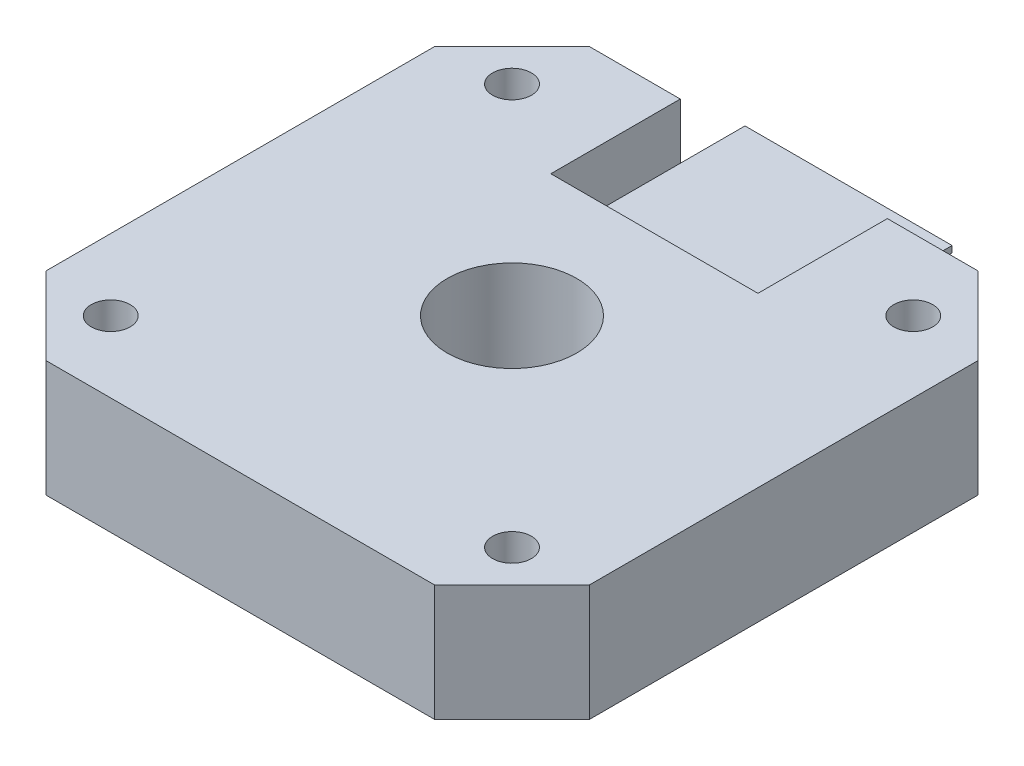
ISO-10303-21;
HEADER;
FILE_DESCRIPTION(('STEP AP214'),'2;1');
FILE_NAME('part.step','',(''),(''),'','','');
FILE_SCHEMA(('AUTOMOTIVE_DESIGN { 1 0 10303 214 1 1 1 1 }'));
ENDSEC;
DATA;
#1=APPLICATION_CONTEXT('core data for automotive mechanical design processes');
#2=APPLICATION_PROTOCOL_DEFINITION('international standard','automotive_design',2000,#1);
#3=PRODUCT_CONTEXT('',#1,'mechanical');
#4=PRODUCT('Part','Part','',(#3));
#5=PRODUCT_RELATED_PRODUCT_CATEGORY('part','',(#4));
#6=PRODUCT_DEFINITION_FORMATION('','',#4);
#7=PRODUCT_DEFINITION_CONTEXT('part definition',#1,'design');
#8=PRODUCT_DEFINITION('design','',#6,#7);
#9=PRODUCT_DEFINITION_SHAPE('','',#8);
#10=(LENGTH_UNIT() NAMED_UNIT(*) SI_UNIT(.MILLI.,.METRE.));
#11=(NAMED_UNIT(*) PLANE_ANGLE_UNIT() SI_UNIT($,.RADIAN.));
#12=(NAMED_UNIT(*) SI_UNIT($,.STERADIAN.) SOLID_ANGLE_UNIT());
#13=UNCERTAINTY_MEASURE_WITH_UNIT(LENGTH_MEASURE(1.E-05),#10,'distance_accuracy_value','');
#14=(GEOMETRIC_REPRESENTATION_CONTEXT(3) GLOBAL_UNCERTAINTY_ASSIGNED_CONTEXT((#13)) GLOBAL_UNIT_ASSIGNED_CONTEXT((#10,
#11,#12)) REPRESENTATION_CONTEXT('',''));
#15=CARTESIAN_POINT('',(0.,0.,0.));
#16=DIRECTION('',(0.,0.,1.));
#17=DIRECTION('',(1.,0.,0.));
#18=AXIS2_PLACEMENT_3D('',#15,#16,#17);
#19=CARTESIAN_POINT('',(8.00000000000001,4.7,-11.));
#20=DIRECTION('',(1.,0.,0.));
#21=DIRECTION('',(0.,0.,-1.));
#22=AXIS2_PLACEMENT_3D('',#19,#20,#21);
#23=PLANE('',#22);
#24=DIRECTION('',(0.,1.,0.));
#25=VECTOR('',#24,1.);
#26=CARTESIAN_POINT('',(8.00000000000001,4.45,-26.));
#27=LINE('',#26,#25);
#28=CARTESIAN_POINT('',(8.00000000000001,4.7,-26.));
#29=VERTEX_POINT('',#28);
#30=CARTESIAN_POINT('',(8.00000000000001,4.2,-26.));
#31=VERTEX_POINT('',#30);
#32=EDGE_CURVE('E449',#29,#31,#27,.F.);
#33=ORIENTED_EDGE('',*,*,#32,.F.);
#34=DIRECTION('',(0.,0.,1.));
#35=VECTOR('',#34,1.);
#36=CARTESIAN_POINT('',(8.00000000000001,4.7,-11.));
#37=LINE('',#36,#35);
#38=CARTESIAN_POINT('',(8.00000000000001,4.7,-21.));
#39=VERTEX_POINT('',#38);
#40=EDGE_CURVE('E411',#39,#29,#37,.F.);
#41=ORIENTED_EDGE('',*,*,#40,.F.);
#42=DIRECTION('',(0.,1.,0.));
#43=VECTOR('',#42,1.);
#44=CARTESIAN_POINT('',(8.00000000000001,4.7,-21.));
#45=LINE('',#44,#43);
#46=CARTESIAN_POINT('',(8.00000000000001,4.2,-21.));
#47=VERTEX_POINT('',#46);
#48=EDGE_CURVE('E459',#39,#47,#45,.F.);
#49=ORIENTED_EDGE('',*,*,#48,.T.);
#50=DIRECTION('',(0.,0.,1.));
#51=VECTOR('',#50,1.);
#52=CARTESIAN_POINT('',(8.00000000000001,4.2,-11.));
#53=LINE('',#52,#51);
#54=EDGE_CURVE('E414',#31,#47,#53,.T.);
#55=ORIENTED_EDGE('',*,*,#54,.F.);
#56=EDGE_LOOP('',(#33,#41,#49,#55));
#57=FACE_BOUND('',#56,.T.);
#58=ADVANCED_FACE('F17',(#57),#23,.T.);
#59=CARTESIAN_POINT('',(0.,4.45,-26.));
#60=DIRECTION('',(0.,0.,-1.));
#61=DIRECTION('',(-1.,0.,0.));
#62=AXIS2_PLACEMENT_3D('',#59,#60,#61);
#63=PLANE('',#62);
#64=DIRECTION('',(0.,1.,0.));
#65=VECTOR('',#64,1.);
#66=CARTESIAN_POINT('',(-7.99999999999999,4.2,-26.));
#67=LINE('',#66,#65);
#68=CARTESIAN_POINT('',(-7.99999999999999,4.7,-26.));
#69=VERTEX_POINT('',#68);
#70=CARTESIAN_POINT('',(-7.99999999999999,4.2,-26.));
#71=VERTEX_POINT('',#70);
#72=EDGE_CURVE('E444',#69,#71,#67,.F.);
#73=ORIENTED_EDGE('',*,*,#72,.F.);
#74=DIRECTION('',(1.,0.,0.));
#75=VECTOR('',#74,1.);
#76=CARTESIAN_POINT('',(-7.99999999999999,4.7,-26.));
#77=LINE('',#76,#75);
#78=EDGE_CURVE('E413',#29,#69,#77,.F.);
#79=ORIENTED_EDGE('',*,*,#78,.F.);
#80=ORIENTED_EDGE('',*,*,#32,.T.);
#81=DIRECTION('',(1.,0.,0.));
#82=VECTOR('',#81,1.);
#83=CARTESIAN_POINT('',(8.00000000000001,4.2,-26.));
#84=LINE('',#83,#82);
#85=EDGE_CURVE('E430',#71,#31,#84,.T.);
#86=ORIENTED_EDGE('',*,*,#85,.F.);
#87=EDGE_LOOP('',(#73,#79,#80,#86));
#88=FACE_BOUND('',#87,.T.);
#89=ADVANCED_FACE('F614',(#88),#63,.T.);
#90=CARTESIAN_POINT('',(-7.99999999999999,4.2,-11.));
#91=DIRECTION('',(-1.,0.,0.));
#92=DIRECTION('',(0.,0.,1.));
#93=AXIS2_PLACEMENT_3D('',#90,#91,#92);
#94=PLANE('',#93);
#95=ORIENTED_EDGE('',*,*,#72,.T.);
#96=DIRECTION('',(0.,0.,1.));
#97=VECTOR('',#96,1.);
#98=CARTESIAN_POINT('',(-7.99999999999999,4.2,-11.));
#99=LINE('',#98,#97);
#100=CARTESIAN_POINT('',(-7.99999999999999,4.2,-21.));
#101=VERTEX_POINT('',#100);
#102=EDGE_CURVE('E441',#101,#71,#99,.F.);
#103=ORIENTED_EDGE('',*,*,#102,.F.);
#104=DIRECTION('',(0.,1.,0.));
#105=VECTOR('',#104,1.);
#106=CARTESIAN_POINT('',(-7.99999999999999,4.2,-21.));
#107=LINE('',#106,#105);
#108=CARTESIAN_POINT('',(-7.99999999999999,4.7,-21.));
#109=VERTEX_POINT('',#108);
#110=EDGE_CURVE('E447',#101,#109,#107,.T.);
#111=ORIENTED_EDGE('',*,*,#110,.T.);
#112=DIRECTION('',(0.,0.,1.));
#113=VECTOR('',#112,1.);
#114=CARTESIAN_POINT('',(-7.99999999999999,4.7,-11.));
#115=LINE('',#114,#113);
#116=EDGE_CURVE('E408',#69,#109,#115,.T.);
#117=ORIENTED_EDGE('',*,*,#116,.F.);
#118=EDGE_LOOP('',(#95,#103,#111,#117));
#119=FACE_BOUND('',#118,.T.);
#120=ADVANCED_FACE('F1051',(#119),#94,.T.);
#121=CARTESIAN_POINT('',(8.00000000000001,4.2,-11.));
#122=DIRECTION('',(0.,-1.,0.));
#123=DIRECTION('',(1.,0.,0.));
#124=AXIS2_PLACEMENT_3D('',#121,#122,#123);
#125=PLANE('',#124);
#126=ORIENTED_EDGE('',*,*,#54,.T.);
#127=DIRECTION('',(0.,0.,1.));
#128=VECTOR('',#127,1.);
#129=CARTESIAN_POINT('',(8.00000000000001,4.2,-21.));
#130=LINE('',#129,#128);
#131=CARTESIAN_POINT('',(8.00000000000001,4.2,-11.));
#132=VERTEX_POINT('',#131);
#133=EDGE_CURVE('E388',#47,#132,#130,.T.);
#134=ORIENTED_EDGE('',*,*,#133,.T.);
#135=DIRECTION('',(1.,0.,0.));
#136=VECTOR('',#135,1.);
#137=CARTESIAN_POINT('',(0.,4.2,-11.));
#138=LINE('',#137,#136);
#139=CARTESIAN_POINT('',(-7.99999999999999,4.2,-11.));
#140=VERTEX_POINT('',#139);
#141=EDGE_CURVE('E394',#132,#140,#138,.F.);
#142=ORIENTED_EDGE('',*,*,#141,.T.);
#143=DIRECTION('',(0.,0.,1.));
#144=VECTOR('',#143,1.);
#145=CARTESIAN_POINT('',(-7.99999999999999,4.2,-21.));
#146=LINE('',#145,#144);
#147=EDGE_CURVE('E403',#140,#101,#146,.F.);
#148=ORIENTED_EDGE('',*,*,#147,.T.);
#149=ORIENTED_EDGE('',*,*,#102,.T.);
#150=ORIENTED_EDGE('',*,*,#85,.T.);
#151=EDGE_LOOP('',(#126,#134,#142,#148,#149,#150));
#152=FACE_BOUND('',#151,.T.);
#153=ADVANCED_FACE('F610',(#152),#125,.T.);
#154=CARTESIAN_POINT('',(-7.99999999999999,4.7,-11.));
#155=DIRECTION('',(0.,1.,0.));
#156=DIRECTION('',(0.,0.,1.));
#157=AXIS2_PLACEMENT_3D('',#154,#155,#156);
#158=PLANE('',#157);
#159=ORIENTED_EDGE('',*,*,#116,.T.);
#160=DIRECTION('',(0.,0.,1.));
#161=VECTOR('',#160,1.);
#162=CARTESIAN_POINT('',(-7.99999999999999,4.7,-21.));
#163=LINE('',#162,#161);
#164=CARTESIAN_POINT('',(-7.99999999999999,4.7,-11.));
#165=VERTEX_POINT('',#164);
#166=EDGE_CURVE('E363',#109,#165,#163,.T.);
#167=ORIENTED_EDGE('',*,*,#166,.T.);
#168=DIRECTION('',(1.,0.,0.));
#169=VECTOR('',#168,1.);
#170=CARTESIAN_POINT('',(0.,4.7,-11.));
#171=LINE('',#170,#169);
#172=CARTESIAN_POINT('',(8.00000000000001,4.7,-11.));
#173=VERTEX_POINT('',#172);
#174=EDGE_CURVE('E376',#165,#173,#171,.T.);
#175=ORIENTED_EDGE('',*,*,#174,.T.);
#176=DIRECTION('',(0.,0.,1.));
#177=VECTOR('',#176,1.);
#178=CARTESIAN_POINT('',(8.00000000000001,4.7,-21.));
#179=LINE('',#178,#177);
#180=EDGE_CURVE('E321',#173,#39,#179,.F.);
#181=ORIENTED_EDGE('',*,*,#180,.T.);
#182=ORIENTED_EDGE('',*,*,#40,.T.);
#183=ORIENTED_EDGE('',*,*,#78,.T.);
#184=EDGE_LOOP('',(#159,#167,#175,#181,#182,#183));
#185=FACE_BOUND('',#184,.T.);
#186=ADVANCED_FACE('F559',(#185),#158,.T.);
#187=CARTESIAN_POINT('',(-7.99999999999999,9.,-21.));
#188=DIRECTION('',(-1.,0.,0.));
#189=DIRECTION('',(0.,0.,1.));
#190=AXIS2_PLACEMENT_3D('',#187,#188,#189);
#191=PLANE('',#190);
#192=DIRECTION('',(0.,1.,0.));
#193=VECTOR('',#192,1.);
#194=CARTESIAN_POINT('',(-7.99999999999999,6.5,-11.));
#195=LINE('',#194,#193);
#196=CARTESIAN_POINT('',(-7.99999999999999,4.,-11.));
#197=VERTEX_POINT('',#196);
#198=EDGE_CURVE('E400',#140,#197,#195,.F.);
#199=ORIENTED_EDGE('',*,*,#198,.T.);
#200=DIRECTION('',(0.,0.,1.));
#201=VECTOR('',#200,1.);
#202=CARTESIAN_POINT('',(-7.99999999999999,4.,-23.));
#203=LINE('',#202,#201);
#204=CARTESIAN_POINT('',(-7.99999999999999,4.,-21.));
#205=VERTEX_POINT('',#204);
#206=EDGE_CURVE('E369',#205,#197,#203,.T.);
#207=ORIENTED_EDGE('',*,*,#206,.F.);
#208=DIRECTION('',(0.,1.,0.));
#209=VECTOR('',#208,1.);
#210=CARTESIAN_POINT('',(-7.99999999999999,9.,-21.));
#211=LINE('',#210,#209);
#212=EDGE_CURVE('E406',#101,#205,#211,.F.);
#213=ORIENTED_EDGE('',*,*,#212,.F.);
#214=ORIENTED_EDGE('',*,*,#147,.F.);
#215=EDGE_LOOP('',(#199,#207,#213,#214));
#216=FACE_BOUND('',#215,.T.);
#217=ADVANCED_FACE('F605',(#216),#191,.F.);
#218=CARTESIAN_POINT('',(0.,6.5,-11.));
#219=DIRECTION('',(0.,0.,1.));
#220=DIRECTION('',(1.,0.,0.));
#221=AXIS2_PLACEMENT_3D('',#218,#219,#220);
#222=PLANE('',#221);
#223=DIRECTION('',(0.,1.,0.));
#224=VECTOR('',#223,1.);
#225=CARTESIAN_POINT('',(8.00000000000001,4.,-11.));
#226=LINE('',#225,#224);
#227=CARTESIAN_POINT('',(8.00000000000001,4.,-11.));
#228=VERTEX_POINT('',#227);
#229=EDGE_CURVE('E389',#132,#228,#226,.F.);
#230=ORIENTED_EDGE('',*,*,#229,.T.);
#231=DIRECTION('',(1.,0.,0.));
#232=VECTOR('',#231,1.);
#233=CARTESIAN_POINT('',(0.,4.,-11.));
#234=LINE('',#233,#232);
#235=EDGE_CURVE('E302',#197,#228,#234,.T.);
#236=ORIENTED_EDGE('',*,*,#235,.F.);
#237=ORIENTED_EDGE('',*,*,#198,.F.);
#238=ORIENTED_EDGE('',*,*,#141,.F.);
#239=EDGE_LOOP('',(#230,#236,#237,#238));
#240=FACE_BOUND('',#239,.T.);
#241=ADVANCED_FACE('F608',(#240),#222,.F.);
#242=CARTESIAN_POINT('',(8.00000000000001,4.,-21.));
#243=DIRECTION('',(1.,0.,0.));
#244=DIRECTION('',(0.,1.,0.));
#245=AXIS2_PLACEMENT_3D('',#242,#243,#244);
#246=PLANE('',#245);
#247=DIRECTION('',(0.,1.,0.));
#248=VECTOR('',#247,1.);
#249=CARTESIAN_POINT('',(8.00000000000001,4.,-21.));
#250=LINE('',#249,#248);
#251=CARTESIAN_POINT('',(8.00000000000001,4.,-21.));
#252=VERTEX_POINT('',#251);
#253=EDGE_CURVE('E386',#252,#47,#250,.T.);
#254=ORIENTED_EDGE('',*,*,#253,.F.);
#255=DIRECTION('',(0.,0.,1.));
#256=VECTOR('',#255,1.);
#257=CARTESIAN_POINT('',(8.00000000000001,4.,-23.));
#258=LINE('',#257,#256);
#259=EDGE_CURVE('E298',#228,#252,#258,.F.);
#260=ORIENTED_EDGE('',*,*,#259,.F.);
#261=ORIENTED_EDGE('',*,*,#229,.F.);
#262=ORIENTED_EDGE('',*,*,#133,.F.);
#263=EDGE_LOOP('',(#254,#260,#261,#262));
#264=FACE_BOUND('',#263,.T.);
#265=ADVANCED_FACE('F548',(#264),#246,.F.);
#266=CARTESIAN_POINT('',(0.,6.5,-11.));
#267=DIRECTION('',(0.,0.,1.));
#268=DIRECTION('',(1.,0.,0.));
#269=AXIS2_PLACEMENT_3D('',#266,#267,#268);
#270=PLANE('',#269);
#271=DIRECTION('',(0.,1.,0.));
#272=VECTOR('',#271,1.);
#273=CARTESIAN_POINT('',(-7.99999999999999,9.,-11.));
#274=LINE('',#273,#272);
#275=CARTESIAN_POINT('',(-7.99999999999999,9.,-11.));
#276=VERTEX_POINT('',#275);
#277=EDGE_CURVE('E366',#165,#276,#274,.T.);
#278=ORIENTED_EDGE('',*,*,#277,.T.);
#279=DIRECTION('',(1.,0.,0.));
#280=VECTOR('',#279,1.);
#281=CARTESIAN_POINT('',(0.,9.,-11.));
#282=LINE('',#281,#280);
#283=CARTESIAN_POINT('',(8.00000000000001,9.,-11.));
#284=VERTEX_POINT('',#283);
#285=EDGE_CURVE('E314',#284,#276,#282,.F.);
#286=ORIENTED_EDGE('',*,*,#285,.F.);
#287=DIRECTION('',(0.,1.,0.));
#288=VECTOR('',#287,1.);
#289=CARTESIAN_POINT('',(8.00000000000001,4.,-11.));
#290=LINE('',#289,#288);
#291=EDGE_CURVE('E324',#284,#173,#290,.F.);
#292=ORIENTED_EDGE('',*,*,#291,.T.);
#293=ORIENTED_EDGE('',*,*,#174,.F.);
#294=EDGE_LOOP('',(#278,#286,#292,#293));
#295=FACE_BOUND('',#294,.T.);
#296=ADVANCED_FACE('F624',(#295),#270,.F.);
#297=CARTESIAN_POINT('',(-15.5,9.,15.5));
#298=DIRECTION('',(0.,-1.,0.));
#299=DIRECTION('',(0.,0.,-1.));
#300=AXIS2_PLACEMENT_3D('',#297,#298,#299);
#301=CYLINDRICAL_SURFACE('',#300,1.5);
#302=CARTESIAN_POINT('',(-15.5,9.,15.5));
#303=DIRECTION('',(0.,-1.,0.));
#304=DIRECTION('',(0.,0.,-1.));
#305=AXIS2_PLACEMENT_3D('',#302,#303,#304);
#306=CIRCLE('',#305,1.5);
#307=CARTESIAN_POINT('',(-15.5,9.,14.));
#308=VERTEX_POINT('',#307);
#309=EDGE_CURVE('E352',#308,#308,#306,.T.);
#310=ORIENTED_EDGE('',*,*,#309,.F.);
#311=EDGE_LOOP('',(#310));
#312=FACE_BOUND('',#311,.T.);
#313=CARTESIAN_POINT('',(-15.5,3.,15.5));
#314=DIRECTION('',(0.,-1.,0.));
#315=DIRECTION('',(0.,0.,-1.));
#316=AXIS2_PLACEMENT_3D('',#313,#314,#315);
#317=CIRCLE('',#316,1.5);
#318=CARTESIAN_POINT('',(-15.5,3.,14.));
#319=VERTEX_POINT('',#318);
#320=EDGE_CURVE('E507',#319,#319,#317,.F.);
#321=ORIENTED_EDGE('',*,*,#320,.F.);
#322=EDGE_LOOP('',(#321));
#323=FACE_BOUND('',#322,.T.);
#324=ADVANCED_FACE('F626',(#312,#323),#301,.F.);
#325=CARTESIAN_POINT('',(15.5,9.,15.5));
#326=DIRECTION('',(0.,1.,0.));
#327=DIRECTION('',(0.,0.,1.));
#328=AXIS2_PLACEMENT_3D('',#325,#326,#327);
#329=CYLINDRICAL_SURFACE('',#328,1.5);
#330=CARTESIAN_POINT('',(15.5,9.,15.5));
#331=DIRECTION('',(0.,1.,0.));
#332=DIRECTION('',(0.,0.,1.));
#333=AXIS2_PLACEMENT_3D('',#330,#331,#332);
#334=CIRCLE('',#333,1.5);
#335=CARTESIAN_POINT('',(15.5,9.,17.));
#336=VERTEX_POINT('',#335);
#337=EDGE_CURVE('E500',#336,#336,#334,.F.);
#338=ORIENTED_EDGE('',*,*,#337,.F.);
#339=EDGE_LOOP('',(#338));
#340=FACE_BOUND('',#339,.T.);
#341=CARTESIAN_POINT('',(15.5,3.,15.5));
#342=DIRECTION('',(0.,1.,0.));
#343=DIRECTION('',(0.,0.,1.));
#344=AXIS2_PLACEMENT_3D('',#341,#342,#343);
#345=CIRCLE('',#344,1.5);
#346=CARTESIAN_POINT('',(15.5,3.,17.));
#347=VERTEX_POINT('',#346);
#348=EDGE_CURVE('E315',#347,#347,#345,.F.);
#349=ORIENTED_EDGE('',*,*,#348,.T.);
#350=EDGE_LOOP('',(#349));
#351=FACE_BOUND('',#350,.T.);
#352=ADVANCED_FACE('F633',(#340,#351),#329,.F.);
#353=CARTESIAN_POINT('',(-15.5,9.,-15.5));
#354=DIRECTION('',(0.,1.,0.));
#355=DIRECTION('',(0.,0.,1.));
#356=AXIS2_PLACEMENT_3D('',#353,#354,#355);
#357=CYLINDRICAL_SURFACE('',#356,1.5);
#358=CARTESIAN_POINT('',(-15.5,9.,-15.5));
#359=DIRECTION('',(0.,1.,0.));
#360=DIRECTION('',(0.,0.,1.));
#361=AXIS2_PLACEMENT_3D('',#358,#359,#360);
#362=CIRCLE('',#361,1.5);
#363=CARTESIAN_POINT('',(-15.5,9.,-14.));
#364=VERTEX_POINT('',#363);
#365=EDGE_CURVE('E497',#364,#364,#362,.F.);
#366=ORIENTED_EDGE('',*,*,#365,.F.);
#367=EDGE_LOOP('',(#366));
#368=FACE_BOUND('',#367,.T.);
#369=CARTESIAN_POINT('',(-15.5,3.,-15.5));
#370=DIRECTION('',(0.,1.,0.));
#371=DIRECTION('',(0.,0.,1.));
#372=AXIS2_PLACEMENT_3D('',#369,#370,#371);
#373=CIRCLE('',#372,1.5);
#374=CARTESIAN_POINT('',(-15.5,3.,-14.));
#375=VERTEX_POINT('',#374);
#376=EDGE_CURVE('E513',#375,#375,#373,.F.);
#377=ORIENTED_EDGE('',*,*,#376,.T.);
#378=EDGE_LOOP('',(#377));
#379=FACE_BOUND('',#378,.T.);
#380=ADVANCED_FACE('F724',(#368,#379),#357,.F.);
#381=CARTESIAN_POINT('',(15.5,9.,-15.5));
#382=DIRECTION('',(0.,-1.,0.));
#383=DIRECTION('',(0.,0.,-1.));
#384=AXIS2_PLACEMENT_3D('',#381,#382,#383);
#385=CYLINDRICAL_SURFACE('',#384,1.5);
#386=CARTESIAN_POINT('',(15.5,9.,-15.5));
#387=DIRECTION('',(0.,-1.,0.));
#388=DIRECTION('',(0.,0.,-1.));
#389=AXIS2_PLACEMENT_3D('',#386,#387,#388);
#390=CIRCLE('',#389,1.5);
#391=CARTESIAN_POINT('',(15.5,9.,-17.));
#392=VERTEX_POINT('',#391);
#393=EDGE_CURVE('E291',#392,#392,#390,.T.);
#394=ORIENTED_EDGE('',*,*,#393,.F.);
#395=EDGE_LOOP('',(#394));
#396=FACE_BOUND('',#395,.T.);
#397=CARTESIAN_POINT('',(15.5,3.,-15.5));
#398=DIRECTION('',(0.,-1.,0.));
#399=DIRECTION('',(0.,0.,-1.));
#400=AXIS2_PLACEMENT_3D('',#397,#398,#399);
#401=CIRCLE('',#400,1.5);
#402=CARTESIAN_POINT('',(15.5,3.,-17.));
#403=VERTEX_POINT('',#402);
#404=EDGE_CURVE('E510',#403,#403,#401,.F.);
#405=ORIENTED_EDGE('',*,*,#404,.F.);
#406=EDGE_LOOP('',(#405));
#407=FACE_BOUND('',#406,.T.);
#408=ADVANCED_FACE('F721',(#396,#407),#385,.F.);
#409=CARTESIAN_POINT('',(-7.99999999999999,9.,-21.));
#410=DIRECTION('',(-1.,0.,0.));
#411=DIRECTION('',(0.,0.,1.));
#412=AXIS2_PLACEMENT_3D('',#409,#410,#411);
#413=PLANE('',#412);
#414=DIRECTION('',(0.,1.,0.));
#415=VECTOR('',#414,1.);
#416=CARTESIAN_POINT('',(-7.99999999999999,0.,-21.));
#417=LINE('',#416,#415);
#418=CARTESIAN_POINT('',(-7.99999999999999,9.,-21.));
#419=VERTEX_POINT('',#418);
#420=EDGE_CURVE('E284',#419,#109,#417,.F.);
#421=ORIENTED_EDGE('',*,*,#420,.F.);
#422=DIRECTION('',(0.,0.,1.));
#423=VECTOR('',#422,1.);
#424=CARTESIAN_POINT('',(-7.99999999999999,9.,0.));
#425=LINE('',#424,#423);
#426=EDGE_CURVE('E350',#276,#419,#425,.F.);
#427=ORIENTED_EDGE('',*,*,#426,.F.);
#428=ORIENTED_EDGE('',*,*,#277,.F.);
#429=ORIENTED_EDGE('',*,*,#166,.F.);
#430=EDGE_LOOP('',(#421,#427,#428,#429));
#431=FACE_BOUND('',#430,.T.);
#432=ADVANCED_FACE('F621',(#431),#413,.F.);
#433=CARTESIAN_POINT('',(8.00000000000001,4.,-21.));
#434=DIRECTION('',(1.,0.,0.));
#435=DIRECTION('',(0.,1.,0.));
#436=AXIS2_PLACEMENT_3D('',#433,#434,#435);
#437=PLANE('',#436);
#438=ORIENTED_EDGE('',*,*,#291,.F.);
#439=DIRECTION('',(0.,0.,1.));
#440=VECTOR('',#439,1.);
#441=CARTESIAN_POINT('',(8.00000000000001,9.,0.));
#442=LINE('',#441,#440);
#443=CARTESIAN_POINT('',(8.00000000000001,9.,-21.));
#444=VERTEX_POINT('',#443);
#445=EDGE_CURVE('E311',#444,#284,#442,.T.);
#446=ORIENTED_EDGE('',*,*,#445,.F.);
#447=DIRECTION('',(0.,1.,0.));
#448=VECTOR('',#447,1.);
#449=CARTESIAN_POINT('',(8.00000000000001,0.,-21.));
#450=LINE('',#449,#448);
#451=EDGE_CURVE('E212',#39,#444,#450,.T.);
#452=ORIENTED_EDGE('',*,*,#451,.F.);
#453=ORIENTED_EDGE('',*,*,#180,.F.);
#454=EDGE_LOOP('',(#438,#446,#452,#453));
#455=FACE_BOUND('',#454,.T.);
#456=ADVANCED_FACE('F561',(#455),#437,.F.);
#457=CARTESIAN_POINT('',(-7.49999999999999,0.,-24.5));
#458=DIRECTION('',(0.,1.,0.));
#459=DIRECTION('',(0.,0.,1.));
#460=AXIS2_PLACEMENT_3D('',#457,#458,#459);
#461=CYLINDRICAL_SURFACE('',#460,0.5);
#462=CARTESIAN_POINT('',(-7.49999999999999,0.,-24.5));
#463=DIRECTION('',(0.,1.,0.));
#464=DIRECTION('',(0.,0.,1.));
#465=AXIS2_PLACEMENT_3D('',#462,#463,#464);
#466=CIRCLE('',#465,0.5);
#467=CARTESIAN_POINT('',(-7.49999999999999,0.,-25.));
#468=VERTEX_POINT('',#467);
#469=CARTESIAN_POINT('',(-7.99999999999999,0.,-24.5));
#470=VERTEX_POINT('',#469);
#471=EDGE_CURVE('E20',#468,#470,#466,.T.);
#472=ORIENTED_EDGE('',*,*,#471,.T.);
#473=DIRECTION('',(0.,1.,0.));
#474=VECTOR('',#473,1.);
#475=CARTESIAN_POINT('',(-7.99999999999999,0.,-24.5));
#476=LINE('',#475,#474);
#477=CARTESIAN_POINT('',(-7.99999999999999,4.,-24.5));
#478=VERTEX_POINT('',#477);
#479=EDGE_CURVE('E287',#478,#470,#476,.F.);
#480=ORIENTED_EDGE('',*,*,#479,.F.);
#481=CARTESIAN_POINT('',(-7.49999999999999,4.,-24.5));
#482=DIRECTION('',(0.,1.,0.));
#483=DIRECTION('',(0.,0.,1.));
#484=AXIS2_PLACEMENT_3D('',#481,#482,#483);
#485=CIRCLE('',#484,0.5);
#486=CARTESIAN_POINT('',(-7.49999999999999,4.,-25.));
#487=VERTEX_POINT('',#486);
#488=EDGE_CURVE('E371',#487,#478,#485,.T.);
#489=ORIENTED_EDGE('',*,*,#488,.F.);
#490=DIRECTION('',(0.,1.,0.));
#491=VECTOR('',#490,1.);
#492=CARTESIAN_POINT('',(-7.49999999999999,0.,-25.));
#493=LINE('',#492,#491);
#494=EDGE_CURVE('E180',#468,#487,#493,.T.);
#495=ORIENTED_EDGE('',*,*,#494,.F.);
#496=EDGE_LOOP('',(#472,#480,#489,#495));
#497=FACE_BOUND('',#496,.T.);
#498=ADVANCED_FACE('F523',(#497),#461,.T.);
#499=CARTESIAN_POINT('',(0.,4.,-23.));
#500=DIRECTION('',(0.,1.,0.));
#501=DIRECTION('',(0.,0.,1.));
#502=AXIS2_PLACEMENT_3D('',#499,#500,#501);
#503=PLANE('',#502);
#504=CARTESIAN_POINT('',(7.50000000000001,4.,-24.5));
#505=DIRECTION('',(0.,1.,0.));
#506=DIRECTION('',(0.,0.,1.));
#507=AXIS2_PLACEMENT_3D('',#504,#505,#506);
#508=CIRCLE('',#507,0.5);
#509=CARTESIAN_POINT('',(7.50000000000001,4.,-25.));
#510=VERTEX_POINT('',#509);
#511=CARTESIAN_POINT('',(8.00000000000001,4.,-24.5));
#512=VERTEX_POINT('',#511);
#513=EDGE_CURVE('E301',#510,#512,#508,.F.);
#514=ORIENTED_EDGE('',*,*,#513,.F.);
#515=DIRECTION('',(-1.,0.,0.));
#516=VECTOR('',#515,1.);
#517=CARTESIAN_POINT('',(8.00000000000001,4.,-25.));
#518=LINE('',#517,#516);
#519=EDGE_CURVE('E292',#487,#510,#518,.F.);
#520=ORIENTED_EDGE('',*,*,#519,.F.);
#521=ORIENTED_EDGE('',*,*,#488,.T.);
#522=DIRECTION('',(0.,0.,1.));
#523=VECTOR('',#522,1.);
#524=CARTESIAN_POINT('',(-7.99999999999999,4.,-25.));
#525=LINE('',#524,#523);
#526=EDGE_CURVE('E290',#205,#478,#525,.F.);
#527=ORIENTED_EDGE('',*,*,#526,.F.);
#528=ORIENTED_EDGE('',*,*,#206,.T.);
#529=ORIENTED_EDGE('',*,*,#235,.T.);
#530=ORIENTED_EDGE('',*,*,#259,.T.);
#531=DIRECTION('',(0.,0.,-1.));
#532=VECTOR('',#531,1.);
#533=CARTESIAN_POINT('',(8.00000000000001,4.,-21.));
#534=LINE('',#533,#532);
#535=EDGE_CURVE('E176',#512,#252,#534,.F.);
#536=ORIENTED_EDGE('',*,*,#535,.F.);
#537=EDGE_LOOP('',(#514,#520,#521,#527,#528,#529,#530,#536));
#538=FACE_BOUND('',#537,.T.);
#539=ADVANCED_FACE('F542',(#538),#503,.T.);
#540=CARTESIAN_POINT('',(7.50000000000001,0.,-24.5));
#541=DIRECTION('',(0.,1.,0.));
#542=DIRECTION('',(0.,0.,1.));
#543=AXIS2_PLACEMENT_3D('',#540,#541,#542);
#544=CYLINDRICAL_SURFACE('',#543,0.5);
#545=CARTESIAN_POINT('',(7.50000000000001,0.,-24.5));
#546=DIRECTION('',(0.,1.,0.));
#547=DIRECTION('',(0.,0.,1.));
#548=AXIS2_PLACEMENT_3D('',#545,#546,#547);
#549=CIRCLE('',#548,0.5);
#550=CARTESIAN_POINT('',(8.00000000000001,0.,-24.5));
#551=VERTEX_POINT('',#550);
#552=CARTESIAN_POINT('',(7.50000000000001,0.,-25.));
#553=VERTEX_POINT('',#552);
#554=EDGE_CURVE('E187',#551,#553,#549,.T.);
#555=ORIENTED_EDGE('',*,*,#554,.T.);
#556=DIRECTION('',(0.,1.,0.));
#557=VECTOR('',#556,1.);
#558=CARTESIAN_POINT('',(7.50000000000001,0.,-25.));
#559=LINE('',#558,#557);
#560=EDGE_CURVE('E294',#510,#553,#559,.F.);
#561=ORIENTED_EDGE('',*,*,#560,.F.);
#562=ORIENTED_EDGE('',*,*,#513,.T.);
#563=DIRECTION('',(0.,1.,0.));
#564=VECTOR('',#563,1.);
#565=CARTESIAN_POINT('',(8.00000000000001,0.,-24.5));
#566=LINE('',#565,#564);
#567=EDGE_CURVE('E204',#551,#512,#566,.T.);
#568=ORIENTED_EDGE('',*,*,#567,.F.);
#569=EDGE_LOOP('',(#555,#561,#562,#568));
#570=FACE_BOUND('',#569,.T.);
#571=ADVANCED_FACE('F709',(#570),#544,.T.);
#572=CARTESIAN_POINT('',(-15.5,3.,-15.5));
#573=DIRECTION('',(0.,1.,0.));
#574=DIRECTION('',(0.,0.,1.));
#575=AXIS2_PLACEMENT_3D('',#572,#573,#574);
#576=PLANE('',#575);
#577=ORIENTED_EDGE('',*,*,#376,.F.);
#578=EDGE_LOOP('',(#577));
#579=FACE_BOUND('',#578,.T.);
#580=CARTESIAN_POINT('',(-15.5,3.,-15.5));
#581=DIRECTION('',(0.,1.,0.));
#582=DIRECTION('',(0.,0.,1.));
#583=AXIS2_PLACEMENT_3D('',#580,#581,#582);
#584=CIRCLE('',#583,3.);
#585=CARTESIAN_POINT('',(-15.5,3.,-12.5));
#586=VERTEX_POINT('',#585);
#587=EDGE_CURVE('E492',#586,#586,#584,.F.);
#588=ORIENTED_EDGE('',*,*,#587,.T.);
#589=EDGE_LOOP('',(#588));
#590=FACE_BOUND('',#589,.T.);
#591=ADVANCED_FACE('F705',(#579,#590),#576,.F.);
#592=CARTESIAN_POINT('',(15.5,3.,-15.5));
#593=DIRECTION('',(0.,-1.,0.));
#594=DIRECTION('',(0.,0.,-1.));
#595=AXIS2_PLACEMENT_3D('',#592,#593,#594);
#596=PLANE('',#595);
#597=ORIENTED_EDGE('',*,*,#404,.T.);
#598=EDGE_LOOP('',(#597));
#599=FACE_BOUND('',#598,.T.);
#600=CARTESIAN_POINT('',(15.5,3.,-15.5));
#601=DIRECTION('',(0.,-1.,0.));
#602=DIRECTION('',(0.,0.,-1.));
#603=AXIS2_PLACEMENT_3D('',#600,#601,#602);
#604=CIRCLE('',#603,3.);
#605=CARTESIAN_POINT('',(15.5,3.,-18.5));
#606=VERTEX_POINT('',#605);
#607=EDGE_CURVE('E489',#606,#606,#604,.T.);
#608=ORIENTED_EDGE('',*,*,#607,.T.);
#609=EDGE_LOOP('',(#608));
#610=FACE_BOUND('',#609,.T.);
#611=ADVANCED_FACE('F701',(#599,#610),#596,.T.);
#612=CARTESIAN_POINT('',(-15.5,3.,15.5));
#613=DIRECTION('',(0.,-1.,0.));
#614=DIRECTION('',(0.,0.,-1.));
#615=AXIS2_PLACEMENT_3D('',#612,#613,#614);
#616=PLANE('',#615);
#617=ORIENTED_EDGE('',*,*,#320,.T.);
#618=EDGE_LOOP('',(#617));
#619=FACE_BOUND('',#618,.T.);
#620=CARTESIAN_POINT('',(-15.5,3.,15.5));
#621=DIRECTION('',(0.,-1.,0.));
#622=DIRECTION('',(0.,0.,-1.));
#623=AXIS2_PLACEMENT_3D('',#620,#621,#622);
#624=CIRCLE('',#623,3.);
#625=CARTESIAN_POINT('',(-15.5,3.,12.5));
#626=VERTEX_POINT('',#625);
#627=EDGE_CURVE('E486',#626,#626,#624,.T.);
#628=ORIENTED_EDGE('',*,*,#627,.T.);
#629=EDGE_LOOP('',(#628));
#630=FACE_BOUND('',#629,.T.);
#631=ADVANCED_FACE('F697',(#619,#630),#616,.T.);
#632=CARTESIAN_POINT('',(15.5,3.,15.5));
#633=DIRECTION('',(0.,1.,0.));
#634=DIRECTION('',(0.,0.,1.));
#635=AXIS2_PLACEMENT_3D('',#632,#633,#634);
#636=PLANE('',#635);
#637=ORIENTED_EDGE('',*,*,#348,.F.);
#638=EDGE_LOOP('',(#637));
#639=FACE_BOUND('',#638,.T.);
#640=CARTESIAN_POINT('',(15.5,3.,15.5));
#641=DIRECTION('',(0.,1.,0.));
#642=DIRECTION('',(0.,0.,1.));
#643=AXIS2_PLACEMENT_3D('',#640,#641,#642);
#644=CIRCLE('',#643,3.);
#645=CARTESIAN_POINT('',(15.5,3.,18.5));
#646=VERTEX_POINT('',#645);
#647=EDGE_CURVE('E483',#646,#646,#644,.F.);
#648=ORIENTED_EDGE('',*,*,#647,.T.);
#649=EDGE_LOOP('',(#648));
#650=FACE_BOUND('',#649,.T.);
#651=ADVANCED_FACE('F693',(#639,#650),#636,.F.);
#652=CARTESIAN_POINT('',(0.,9.,0.));
#653=DIRECTION('',(0.,1.,0.));
#654=DIRECTION('',(0.,0.,1.));
#655=AXIS2_PLACEMENT_3D('',#652,#653,#654);
#656=PLANE('',#655);
#657=ORIENTED_EDGE('',*,*,#393,.T.);
#658=EDGE_LOOP('',(#657));
#659=FACE_BOUND('',#658,.T.);
#660=ORIENTED_EDGE('',*,*,#365,.T.);
#661=EDGE_LOOP('',(#660));
#662=FACE_BOUND('',#661,.T.);
#663=ORIENTED_EDGE('',*,*,#337,.T.);
#664=EDGE_LOOP('',(#663));
#665=FACE_BOUND('',#664,.T.);
#666=ORIENTED_EDGE('',*,*,#309,.T.);
#667=EDGE_LOOP('',(#666));
#668=FACE_BOUND('',#667,.T.);
#669=CARTESIAN_POINT('',(0.,9.,0.));
#670=DIRECTION('',(0.,1.,0.));
#671=DIRECTION('',(0.,0.,1.));
#672=AXIS2_PLACEMENT_3D('',#669,#670,#671);
#673=CIRCLE('',#672,5.);
#674=CARTESIAN_POINT('',(0.,9.,5.));
#675=VERTEX_POINT('',#674);
#676=EDGE_CURVE('E480',#675,#675,#673,.F.);
#677=ORIENTED_EDGE('',*,*,#676,.T.);
#678=EDGE_LOOP('',(#677));
#679=FACE_BOUND('',#678,.T.);
#680=DIRECTION('',(-0.707106781186548,0.,-0.707106781186548));
#681=VECTOR('',#680,1.);
#682=CARTESIAN_POINT('',(18.,9.00000000000001,-18.));
#683=LINE('',#682,#681);
#684=CARTESIAN_POINT('',(15.,9.,-21.));
#685=VERTEX_POINT('',#684);
#686=CARTESIAN_POINT('',(21.,9.00000000000001,-15.));
#687=VERTEX_POINT('',#686);
#688=EDGE_CURVE('E213',#685,#687,#683,.F.);
#689=ORIENTED_EDGE('',*,*,#688,.F.);
#690=DIRECTION('',(-1.,0.,0.));
#691=VECTOR('',#690,1.);
#692=CARTESIAN_POINT('',(21.,9.,-21.));
#693=LINE('',#692,#691);
#694=EDGE_CURVE('E205',#444,#685,#693,.F.);
#695=ORIENTED_EDGE('',*,*,#694,.F.);
#696=ORIENTED_EDGE('',*,*,#445,.T.);
#697=ORIENTED_EDGE('',*,*,#285,.T.);
#698=ORIENTED_EDGE('',*,*,#426,.T.);
#699=DIRECTION('',(-1.,0.,0.));
#700=VECTOR('',#699,1.);
#701=CARTESIAN_POINT('',(21.,9.,-21.));
#702=LINE('',#701,#700);
#703=CARTESIAN_POINT('',(-15.,9.00000000000001,-21.));
#704=VERTEX_POINT('',#703);
#705=EDGE_CURVE('E283',#704,#419,#702,.F.);
#706=ORIENTED_EDGE('',*,*,#705,.F.);
#707=DIRECTION('',(-0.707106781186548,0.,0.707106781186548));
#708=VECTOR('',#707,1.);
#709=CARTESIAN_POINT('',(-18.,9.00000000000001,-18.));
#710=LINE('',#709,#708);
#711=CARTESIAN_POINT('',(-21.,9.,-15.));
#712=VERTEX_POINT('',#711);
#713=EDGE_CURVE('E273',#712,#704,#710,.F.);
#714=ORIENTED_EDGE('',*,*,#713,.F.);
#715=DIRECTION('',(0.,0.,1.));
#716=VECTOR('',#715,1.);
#717=CARTESIAN_POINT('',(-21.,9.,-21.));
#718=LINE('',#717,#716);
#719=CARTESIAN_POINT('',(-21.,9.00000000000001,15.));
#720=VERTEX_POINT('',#719);
#721=EDGE_CURVE('E263',#720,#712,#718,.F.);
#722=ORIENTED_EDGE('',*,*,#721,.F.);
#723=DIRECTION('',(0.707106781186548,0.,0.707106781186548));
#724=VECTOR('',#723,1.);
#725=CARTESIAN_POINT('',(-18.,9.00000000000001,18.));
#726=LINE('',#725,#724);
#727=CARTESIAN_POINT('',(-15.,9.,21.));
#728=VERTEX_POINT('',#727);
#729=EDGE_CURVE('E253',#728,#720,#726,.F.);
#730=ORIENTED_EDGE('',*,*,#729,.F.);
#731=DIRECTION('',(1.,0.,0.));
#732=VECTOR('',#731,1.);
#733=CARTESIAN_POINT('',(-21.,9.,21.));
#734=LINE('',#733,#732);
#735=CARTESIAN_POINT('',(15.,9.00000000000001,21.));
#736=VERTEX_POINT('',#735);
#737=EDGE_CURVE('E243',#736,#728,#734,.F.);
#738=ORIENTED_EDGE('',*,*,#737,.F.);
#739=DIRECTION('',(0.707106781186548,0.,-0.707106781186548));
#740=VECTOR('',#739,1.);
#741=CARTESIAN_POINT('',(18.,9.00000000000001,18.));
#742=LINE('',#741,#740);
#743=CARTESIAN_POINT('',(21.,9.,15.));
#744=VERTEX_POINT('',#743);
#745=EDGE_CURVE('E233',#744,#736,#742,.F.);
#746=ORIENTED_EDGE('',*,*,#745,.F.);
#747=DIRECTION('',(0.,0.,-1.));
#748=VECTOR('',#747,1.);
#749=CARTESIAN_POINT('',(21.,9.,21.));
#750=LINE('',#749,#748);
#751=EDGE_CURVE('E223',#687,#744,#750,.F.);
#752=ORIENTED_EDGE('',*,*,#751,.F.);
#753=EDGE_LOOP('',(#689,#695,#696,#697,#698,#706,#714,#722,#730,#738,#746,#752));
#754=FACE_BOUND('',#753,.T.);
#755=ADVANCED_FACE('F566',(#659,#662,#665,#668,#679,#754),#656,.T.);
#756=CARTESIAN_POINT('',(-7.99999999999999,0.,-25.));
#757=DIRECTION('',(-1.,0.,0.));
#758=DIRECTION('',(0.,0.,1.));
#759=AXIS2_PLACEMENT_3D('',#756,#757,#758);
#760=PLANE('',#759);
#761=DIRECTION('',(0.,1.,0.));
#762=VECTOR('',#761,1.);
#763=CARTESIAN_POINT('',(-7.99999999999999,0.,-21.));
#764=LINE('',#763,#762);
#765=CARTESIAN_POINT('',(-7.99999999999999,0.,-21.));
#766=VERTEX_POINT('',#765);
#767=EDGE_CURVE('E281',#205,#766,#764,.F.);
#768=ORIENTED_EDGE('',*,*,#767,.F.);
#769=ORIENTED_EDGE('',*,*,#526,.T.);
#770=ORIENTED_EDGE('',*,*,#479,.T.);
#771=DIRECTION('',(0.,0.,1.));
#772=VECTOR('',#771,1.);
#773=CARTESIAN_POINT('',(-7.99999999999999,0.,0.));
#774=LINE('',#773,#772);
#775=EDGE_CURVE('E278',#470,#766,#774,.T.);
#776=ORIENTED_EDGE('',*,*,#775,.T.);
#777=EDGE_LOOP('',(#768,#769,#770,#776));
#778=FACE_BOUND('',#777,.T.);
#779=ADVANCED_FACE('F528',(#778),#760,.T.);
#780=CARTESIAN_POINT('',(21.,0.,-21.));
#781=DIRECTION('',(0.,0.,-1.));
#782=DIRECTION('',(-1.,0.,0.));
#783=AXIS2_PLACEMENT_3D('',#780,#781,#782);
#784=PLANE('',#783);
#785=DIRECTION('',(0.,1.,0.));
#786=VECTOR('',#785,1.);
#787=CARTESIAN_POINT('',(-15.,0.,-21.));
#788=LINE('',#787,#786);
#789=CARTESIAN_POINT('',(-15.,0.,-21.));
#790=VERTEX_POINT('',#789);
#791=EDGE_CURVE('E271',#704,#790,#788,.F.);
#792=ORIENTED_EDGE('',*,*,#791,.F.);
#793=ORIENTED_EDGE('',*,*,#705,.T.);
#794=ORIENTED_EDGE('',*,*,#420,.T.);
#795=ORIENTED_EDGE('',*,*,#110,.F.);
#796=ORIENTED_EDGE('',*,*,#212,.T.);
#797=ORIENTED_EDGE('',*,*,#767,.T.);
#798=DIRECTION('',(1.,0.,0.));
#799=VECTOR('',#798,1.);
#800=CARTESIAN_POINT('',(0.,0.,-21.));
#801=LINE('',#800,#799);
#802=EDGE_CURVE('E268',#766,#790,#801,.F.);
#803=ORIENTED_EDGE('',*,*,#802,.T.);
#804=EDGE_LOOP('',(#792,#793,#794,#795,#796,#797,#803));
#805=FACE_BOUND('',#804,.T.);
#806=ADVANCED_FACE('F600',(#805),#784,.T.);
#807=CARTESIAN_POINT('',(-18.,0.,-18.));
#808=DIRECTION('',(-0.707106781186548,0.,-0.707106781186548));
#809=DIRECTION('',(-0.707106781186548,0.,0.707106781186548));
#810=AXIS2_PLACEMENT_3D('',#807,#808,#809);
#811=PLANE('',#810);
#812=DIRECTION('',(-0.707106781186547,0.,0.707106781186547));
#813=VECTOR('',#812,1.);
#814=CARTESIAN_POINT('',(-15.,0.,-21.));
#815=LINE('',#814,#813);
#816=CARTESIAN_POINT('',(-21.,0.,-15.));
#817=VERTEX_POINT('',#816);
#818=EDGE_CURVE('E258',#790,#817,#815,.T.);
#819=ORIENTED_EDGE('',*,*,#818,.T.);
#820=DIRECTION('',(0.,1.,0.));
#821=VECTOR('',#820,1.);
#822=CARTESIAN_POINT('',(-21.,0.,-15.));
#823=LINE('',#822,#821);
#824=EDGE_CURVE('E261',#712,#817,#823,.F.);
#825=ORIENTED_EDGE('',*,*,#824,.F.);
#826=ORIENTED_EDGE('',*,*,#713,.T.);
#827=ORIENTED_EDGE('',*,*,#791,.T.);
#828=EDGE_LOOP('',(#819,#825,#826,#827));
#829=FACE_BOUND('',#828,.T.);
#830=ADVANCED_FACE('F596',(#829),#811,.T.);
#831=CARTESIAN_POINT('',(-21.,0.,-21.));
#832=DIRECTION('',(-1.,0.,0.));
#833=DIRECTION('',(0.,0.,1.));
#834=AXIS2_PLACEMENT_3D('',#831,#832,#833);
#835=PLANE('',#834);
#836=ORIENTED_EDGE('',*,*,#824,.T.);
#837=DIRECTION('',(0.,0.,1.));
#838=VECTOR('',#837,1.);
#839=CARTESIAN_POINT('',(-21.,0.,0.));
#840=LINE('',#839,#838);
#841=CARTESIAN_POINT('',(-21.,0.,15.));
#842=VERTEX_POINT('',#841);
#843=EDGE_CURVE('E248',#817,#842,#840,.T.);
#844=ORIENTED_EDGE('',*,*,#843,.T.);
#845=DIRECTION('',(0.,1.,0.));
#846=VECTOR('',#845,1.);
#847=CARTESIAN_POINT('',(-21.,0.,15.));
#848=LINE('',#847,#846);
#849=EDGE_CURVE('E251',#720,#842,#848,.F.);
#850=ORIENTED_EDGE('',*,*,#849,.F.);
#851=ORIENTED_EDGE('',*,*,#721,.T.);
#852=EDGE_LOOP('',(#836,#844,#850,#851));
#853=FACE_BOUND('',#852,.T.);
#854=ADVANCED_FACE('F592',(#853),#835,.T.);
#855=CARTESIAN_POINT('',(-18.,0.,18.));
#856=DIRECTION('',(-0.707106781186548,0.,0.707106781186548));
#857=DIRECTION('',(0.707106781186548,0.,0.707106781186548));
#858=AXIS2_PLACEMENT_3D('',#855,#856,#857);
#859=PLANE('',#858);
#860=DIRECTION('',(0.707106781186547,0.,0.707106781186547));
#861=VECTOR('',#860,1.);
#862=CARTESIAN_POINT('',(-21.,0.,15.));
#863=LINE('',#862,#861);
#864=CARTESIAN_POINT('',(-15.,0.,21.));
#865=VERTEX_POINT('',#864);
#866=EDGE_CURVE('E238',#842,#865,#863,.T.);
#867=ORIENTED_EDGE('',*,*,#866,.T.);
#868=DIRECTION('',(0.,1.,0.));
#869=VECTOR('',#868,1.);
#870=CARTESIAN_POINT('',(-15.,0.,21.));
#871=LINE('',#870,#869);
#872=EDGE_CURVE('E241',#728,#865,#871,.F.);
#873=ORIENTED_EDGE('',*,*,#872,.F.);
#874=ORIENTED_EDGE('',*,*,#729,.T.);
#875=ORIENTED_EDGE('',*,*,#849,.T.);
#876=EDGE_LOOP('',(#867,#873,#874,#875));
#877=FACE_BOUND('',#876,.T.);
#878=ADVANCED_FACE('F587',(#877),#859,.T.);
#879=CARTESIAN_POINT('',(-21.,0.,21.));
#880=DIRECTION('',(0.,0.,1.));
#881=DIRECTION('',(1.,0.,0.));
#882=AXIS2_PLACEMENT_3D('',#879,#880,#881);
#883=PLANE('',#882);
#884=ORIENTED_EDGE('',*,*,#872,.T.);
#885=DIRECTION('',(1.,0.,0.));
#886=VECTOR('',#885,1.);
#887=CARTESIAN_POINT('',(0.,0.,21.));
#888=LINE('',#887,#886);
#889=CARTESIAN_POINT('',(15.,0.,21.));
#890=VERTEX_POINT('',#889);
#891=EDGE_CURVE('E229',#865,#890,#888,.T.);
#892=ORIENTED_EDGE('',*,*,#891,.T.);
#893=DIRECTION('',(0.,1.,0.));
#894=VECTOR('',#893,1.);
#895=CARTESIAN_POINT('',(15.,0.,21.));
#896=LINE('',#895,#894);
#897=EDGE_CURVE('E224',#736,#890,#896,.F.);
#898=ORIENTED_EDGE('',*,*,#897,.F.);
#899=ORIENTED_EDGE('',*,*,#737,.T.);
#900=EDGE_LOOP('',(#884,#892,#898,#899));
#901=FACE_BOUND('',#900,.T.);
#902=ADVANCED_FACE('F583',(#901),#883,.T.);
#903=CARTESIAN_POINT('',(18.,0.,18.));
#904=DIRECTION('',(0.707106781186548,0.,0.707106781186548));
#905=DIRECTION('',(0.707106781186548,0.,-0.707106781186548));
#906=AXIS2_PLACEMENT_3D('',#903,#904,#905);
#907=PLANE('',#906);
#908=DIRECTION('',(0.707106781186547,0.,-0.707106781186547));
#909=VECTOR('',#908,1.);
#910=CARTESIAN_POINT('',(15.,0.,21.));
#911=LINE('',#910,#909);
#912=CARTESIAN_POINT('',(21.,0.,15.));
#913=VERTEX_POINT('',#912);
#914=EDGE_CURVE('E218',#890,#913,#911,.T.);
#915=ORIENTED_EDGE('',*,*,#914,.T.);
#916=DIRECTION('',(0.,1.,0.));
#917=VECTOR('',#916,1.);
#918=CARTESIAN_POINT('',(21.,0.,15.));
#919=LINE('',#918,#917);
#920=EDGE_CURVE('E221',#744,#913,#919,.F.);
#921=ORIENTED_EDGE('',*,*,#920,.F.);
#922=ORIENTED_EDGE('',*,*,#745,.T.);
#923=ORIENTED_EDGE('',*,*,#897,.T.);
#924=EDGE_LOOP('',(#915,#921,#922,#923));
#925=FACE_BOUND('',#924,.T.);
#926=ADVANCED_FACE('F577',(#925),#907,.T.);
#927=CARTESIAN_POINT('',(21.,0.,21.));
#928=DIRECTION('',(1.,0.,0.));
#929=DIRECTION('',(0.,0.,-1.));
#930=AXIS2_PLACEMENT_3D('',#927,#928,#929);
#931=PLANE('',#930);
#932=DIRECTION('',(0.,1.,0.));
#933=VECTOR('',#932,1.);
#934=CARTESIAN_POINT('',(21.,0.,-15.));
#935=LINE('',#934,#933);
#936=CARTESIAN_POINT('',(21.,0.,-15.));
#937=VERTEX_POINT('',#936);
#938=EDGE_CURVE('E210',#687,#937,#935,.F.);
#939=ORIENTED_EDGE('',*,*,#938,.F.);
#940=ORIENTED_EDGE('',*,*,#751,.T.);
#941=ORIENTED_EDGE('',*,*,#920,.T.);
#942=DIRECTION('',(0.,0.,1.));
#943=VECTOR('',#942,1.);
#944=CARTESIAN_POINT('',(21.,0.,0.));
#945=LINE('',#944,#943);
#946=EDGE_CURVE('E196',#913,#937,#945,.F.);
#947=ORIENTED_EDGE('',*,*,#946,.T.);
#948=EDGE_LOOP('',(#939,#940,#941,#947));
#949=FACE_BOUND('',#948,.T.);
#950=ADVANCED_FACE('F574',(#949),#931,.T.);
#951=CARTESIAN_POINT('',(18.,0.,-18.));
#952=DIRECTION('',(0.707106781186548,0.,-0.707106781186548));
#953=DIRECTION('',(-0.707106781186548,0.,-0.707106781186548));
#954=AXIS2_PLACEMENT_3D('',#951,#952,#953);
#955=PLANE('',#954);
#956=DIRECTION('',(-0.707106781186547,0.,-0.707106781186547));
#957=VECTOR('',#956,1.);
#958=CARTESIAN_POINT('',(21.,0.,-15.));
#959=LINE('',#958,#957);
#960=CARTESIAN_POINT('',(15.,0.,-21.));
#961=VERTEX_POINT('',#960);
#962=EDGE_CURVE('E194',#937,#961,#959,.T.);
#963=ORIENTED_EDGE('',*,*,#962,.T.);
#964=DIRECTION('',(0.,1.,0.));
#965=VECTOR('',#964,1.);
#966=CARTESIAN_POINT('',(15.,0.,-21.));
#967=LINE('',#966,#965);
#968=EDGE_CURVE('E193',#685,#961,#967,.F.);
#969=ORIENTED_EDGE('',*,*,#968,.F.);
#970=ORIENTED_EDGE('',*,*,#688,.T.);
#971=ORIENTED_EDGE('',*,*,#938,.T.);
#972=EDGE_LOOP('',(#963,#969,#970,#971));
#973=FACE_BOUND('',#972,.T.);
#974=ADVANCED_FACE('F570',(#973),#955,.T.);
#975=CARTESIAN_POINT('',(21.,0.,-21.));
#976=DIRECTION('',(0.,0.,-1.));
#977=DIRECTION('',(-1.,0.,0.));
#978=AXIS2_PLACEMENT_3D('',#975,#976,#977);
#979=PLANE('',#978);
#980=DIRECTION('',(1.,0.,0.));
#981=VECTOR('',#980,1.);
#982=CARTESIAN_POINT('',(0.,0.,-21.));
#983=LINE('',#982,#981);
#984=CARTESIAN_POINT('',(8.00000000000001,0.,-21.));
#985=VERTEX_POINT('',#984);
#986=EDGE_CURVE('E185',#961,#985,#983,.F.);
#987=ORIENTED_EDGE('',*,*,#986,.T.);
#988=DIRECTION('',(0.,1.,0.));
#989=VECTOR('',#988,1.);
#990=CARTESIAN_POINT('',(8.00000000000001,0.,-21.));
#991=LINE('',#990,#989);
#992=EDGE_CURVE('E170',#252,#985,#991,.F.);
#993=ORIENTED_EDGE('',*,*,#992,.F.);
#994=ORIENTED_EDGE('',*,*,#253,.T.);
#995=ORIENTED_EDGE('',*,*,#48,.F.);
#996=ORIENTED_EDGE('',*,*,#451,.T.);
#997=ORIENTED_EDGE('',*,*,#694,.T.);
#998=ORIENTED_EDGE('',*,*,#968,.T.);
#999=EDGE_LOOP('',(#987,#993,#994,#995,#996,#997,#998));
#1000=FACE_BOUND('',#999,.T.);
#1001=ADVANCED_FACE('F191',(#1000),#979,.T.);
#1002=CARTESIAN_POINT('',(8.00000000000001,0.,-21.));
#1003=DIRECTION('',(1.,0.,0.));
#1004=DIRECTION('',(0.,0.,-1.));
#1005=AXIS2_PLACEMENT_3D('',#1002,#1003,#1004);
#1006=PLANE('',#1005);
#1007=ORIENTED_EDGE('',*,*,#992,.T.);
#1008=DIRECTION('',(0.,0.,1.));
#1009=VECTOR('',#1008,1.);
#1010=CARTESIAN_POINT('',(8.00000000000001,0.,0.));
#1011=LINE('',#1010,#1009);
#1012=EDGE_CURVE('E174',#985,#551,#1011,.F.);
#1013=ORIENTED_EDGE('',*,*,#1012,.T.);
#1014=ORIENTED_EDGE('',*,*,#567,.T.);
#1015=ORIENTED_EDGE('',*,*,#535,.T.);
#1016=EDGE_LOOP('',(#1007,#1013,#1014,#1015));
#1017=FACE_BOUND('',#1016,.T.);
#1018=ADVANCED_FACE('F172',(#1017),#1006,.T.);
#1019=CARTESIAN_POINT('',(8.00000000000001,0.,-25.));
#1020=DIRECTION('',(0.,0.,-1.));
#1021=DIRECTION('',(-1.,0.,0.));
#1022=AXIS2_PLACEMENT_3D('',#1019,#1020,#1021);
#1023=PLANE('',#1022);
#1024=ORIENTED_EDGE('',*,*,#560,.T.);
#1025=DIRECTION('',(1.,0.,0.));
#1026=VECTOR('',#1025,1.);
#1027=CARTESIAN_POINT('',(0.,0.,-25.));
#1028=LINE('',#1027,#1026);
#1029=EDGE_CURVE('E189',#553,#468,#1028,.F.);
#1030=ORIENTED_EDGE('',*,*,#1029,.T.);
#1031=ORIENTED_EDGE('',*,*,#494,.T.);
#1032=ORIENTED_EDGE('',*,*,#519,.T.);
#1033=EDGE_LOOP('',(#1024,#1030,#1031,#1032));
#1034=FACE_BOUND('',#1033,.T.);
#1035=ADVANCED_FACE('F664',(#1034),#1023,.T.);
#1036=CARTESIAN_POINT('',(-15.5,0.,-15.5));
#1037=DIRECTION('',(0.,1.,0.));
#1038=DIRECTION('',(0.,0.,1.));
#1039=AXIS2_PLACEMENT_3D('',#1036,#1037,#1038);
#1040=CYLINDRICAL_SURFACE('',#1039,3.);
#1041=CARTESIAN_POINT('',(-15.5,0.,-15.5));
#1042=DIRECTION('',(0.,1.,0.));
#1043=DIRECTION('',(0.,0.,1.));
#1044=AXIS2_PLACEMENT_3D('',#1041,#1042,#1043);
#1045=CIRCLE('',#1044,3.);
#1046=CARTESIAN_POINT('',(-15.5,0.,-12.5));
#1047=VERTEX_POINT('',#1046);
#1048=EDGE_CURVE('E477',#1047,#1047,#1045,.F.);
#1049=ORIENTED_EDGE('',*,*,#1048,.T.);
#1050=EDGE_LOOP('',(#1049));
#1051=FACE_BOUND('',#1050,.T.);
#1052=ORIENTED_EDGE('',*,*,#587,.F.);
#1053=EDGE_LOOP('',(#1052));
#1054=FACE_BOUND('',#1053,.T.);
#1055=ADVANCED_FACE('F660',(#1051,#1054),#1040,.F.);
#1056=CARTESIAN_POINT('',(15.5,0.,-15.5));
#1057=DIRECTION('',(0.,-1.,0.));
#1058=DIRECTION('',(0.,0.,-1.));
#1059=AXIS2_PLACEMENT_3D('',#1056,#1057,#1058);
#1060=CYLINDRICAL_SURFACE('',#1059,3.);
#1061=CARTESIAN_POINT('',(15.5,0.,-15.5));
#1062=DIRECTION('',(0.,-1.,0.));
#1063=DIRECTION('',(0.,0.,-1.));
#1064=AXIS2_PLACEMENT_3D('',#1061,#1062,#1063);
#1065=CIRCLE('',#1064,3.);
#1066=CARTESIAN_POINT('',(15.5,0.,-18.5));
#1067=VERTEX_POINT('',#1066);
#1068=EDGE_CURVE('E474',#1067,#1067,#1065,.T.);
#1069=ORIENTED_EDGE('',*,*,#1068,.T.);
#1070=EDGE_LOOP('',(#1069));
#1071=FACE_BOUND('',#1070,.T.);
#1072=ORIENTED_EDGE('',*,*,#607,.F.);
#1073=EDGE_LOOP('',(#1072));
#1074=FACE_BOUND('',#1073,.T.);
#1075=ADVANCED_FACE('F656',(#1071,#1074),#1060,.F.);
#1076=CARTESIAN_POINT('',(-15.5,0.,15.5));
#1077=DIRECTION('',(0.,-1.,0.));
#1078=DIRECTION('',(0.,0.,-1.));
#1079=AXIS2_PLACEMENT_3D('',#1076,#1077,#1078);
#1080=CYLINDRICAL_SURFACE('',#1079,3.);
#1081=CARTESIAN_POINT('',(-15.5,0.,15.5));
#1082=DIRECTION('',(0.,-1.,0.));
#1083=DIRECTION('',(0.,0.,-1.));
#1084=AXIS2_PLACEMENT_3D('',#1081,#1082,#1083);
#1085=CIRCLE('',#1084,3.);
#1086=CARTESIAN_POINT('',(-15.5,0.,12.5));
#1087=VERTEX_POINT('',#1086);
#1088=EDGE_CURVE('E471',#1087,#1087,#1085,.T.);
#1089=ORIENTED_EDGE('',*,*,#1088,.T.);
#1090=EDGE_LOOP('',(#1089));
#1091=FACE_BOUND('',#1090,.T.);
#1092=ORIENTED_EDGE('',*,*,#627,.F.);
#1093=EDGE_LOOP('',(#1092));
#1094=FACE_BOUND('',#1093,.T.);
#1095=ADVANCED_FACE('F652',(#1091,#1094),#1080,.F.);
#1096=CARTESIAN_POINT('',(15.5,0.,15.5));
#1097=DIRECTION('',(0.,1.,0.));
#1098=DIRECTION('',(0.,0.,1.));
#1099=AXIS2_PLACEMENT_3D('',#1096,#1097,#1098);
#1100=CYLINDRICAL_SURFACE('',#1099,3.);
#1101=CARTESIAN_POINT('',(15.5,0.,15.5));
#1102=DIRECTION('',(0.,1.,0.));
#1103=DIRECTION('',(0.,0.,1.));
#1104=AXIS2_PLACEMENT_3D('',#1101,#1102,#1103);
#1105=CIRCLE('',#1104,3.);
#1106=CARTESIAN_POINT('',(15.5,0.,18.5));
#1107=VERTEX_POINT('',#1106);
#1108=EDGE_CURVE('E26',#1107,#1107,#1105,.F.);
#1109=ORIENTED_EDGE('',*,*,#1108,.T.);
#1110=EDGE_LOOP('',(#1109));
#1111=FACE_BOUND('',#1110,.T.);
#1112=ORIENTED_EDGE('',*,*,#647,.F.);
#1113=EDGE_LOOP('',(#1112));
#1114=FACE_BOUND('',#1113,.T.);
#1115=ADVANCED_FACE('F644',(#1111,#1114),#1100,.F.);
#1116=CARTESIAN_POINT('',(0.,0.,0.));
#1117=DIRECTION('',(0.,1.,0.));
#1118=DIRECTION('',(0.,0.,1.));
#1119=AXIS2_PLACEMENT_3D('',#1116,#1117,#1118);
#1120=CYLINDRICAL_SURFACE('',#1119,5.);
#1121=CARTESIAN_POINT('',(0.,0.,0.));
#1122=DIRECTION('',(0.,1.,0.));
#1123=DIRECTION('',(0.,0.,1.));
#1124=AXIS2_PLACEMENT_3D('',#1121,#1122,#1123);
#1125=CIRCLE('',#1124,5.);
#1126=CARTESIAN_POINT('',(0.,0.,5.));
#1127=VERTEX_POINT('',#1126);
#1128=EDGE_CURVE('E11',#1127,#1127,#1125,.F.);
#1129=ORIENTED_EDGE('',*,*,#1128,.T.);
#1130=EDGE_LOOP('',(#1129));
#1131=FACE_BOUND('',#1130,.T.);
#1132=ORIENTED_EDGE('',*,*,#676,.F.);
#1133=EDGE_LOOP('',(#1132));
#1134=FACE_BOUND('',#1133,.T.);
#1135=ADVANCED_FACE('F638',(#1131,#1134),#1120,.F.);
#1136=CARTESIAN_POINT('',(0.,0.,0.));
#1137=DIRECTION('',(0.,1.,0.));
#1138=DIRECTION('',(0.,0.,1.));
#1139=AXIS2_PLACEMENT_3D('',#1136,#1137,#1138);
#1140=PLANE('',#1139);
#1141=ORIENTED_EDGE('',*,*,#1128,.F.);
#1142=EDGE_LOOP('',(#1141));
#1143=FACE_BOUND('',#1142,.T.);
#1144=ORIENTED_EDGE('',*,*,#1108,.F.);
#1145=EDGE_LOOP('',(#1144));
#1146=FACE_BOUND('',#1145,.T.);
#1147=ORIENTED_EDGE('',*,*,#1088,.F.);
#1148=EDGE_LOOP('',(#1147));
#1149=FACE_BOUND('',#1148,.T.);
#1150=ORIENTED_EDGE('',*,*,#1068,.F.);
#1151=EDGE_LOOP('',(#1150));
#1152=FACE_BOUND('',#1151,.T.);
#1153=ORIENTED_EDGE('',*,*,#1048,.F.);
#1154=EDGE_LOOP('',(#1153));
#1155=FACE_BOUND('',#1154,.T.);
#1156=ORIENTED_EDGE('',*,*,#1029,.F.);
#1157=ORIENTED_EDGE('',*,*,#554,.F.);
#1158=ORIENTED_EDGE('',*,*,#1012,.F.);
#1159=ORIENTED_EDGE('',*,*,#986,.F.);
#1160=ORIENTED_EDGE('',*,*,#962,.F.);
#1161=ORIENTED_EDGE('',*,*,#946,.F.);
#1162=ORIENTED_EDGE('',*,*,#914,.F.);
#1163=ORIENTED_EDGE('',*,*,#891,.F.);
#1164=ORIENTED_EDGE('',*,*,#866,.F.);
#1165=ORIENTED_EDGE('',*,*,#843,.F.);
#1166=ORIENTED_EDGE('',*,*,#818,.F.);
#1167=ORIENTED_EDGE('',*,*,#802,.F.);
#1168=ORIENTED_EDGE('',*,*,#775,.F.);
#1169=ORIENTED_EDGE('',*,*,#471,.F.);
#1170=EDGE_LOOP('',(#1156,#1157,#1158,#1159,#1160,#1161,#1162,#1163,#1164,#1165,#1166,#1167,
#1168,#1169));
#1171=FACE_BOUND('',#1170,.T.);
#1172=ADVANCED_FACE('F183',(#1143,#1146,#1149,#1152,#1155,#1171),#1140,.F.);
#1173=CLOSED_SHELL('',(#58,#89,#120,#153,#186,#217,#241,#265,#296,#324,#352,#380,#408,#432,#456,
#498,#539,#571,#591,#611,#631,#651,#755,#779,#806,#830,#854,#878,#902,#926,#950,#974,#1001,
#1018,#1035,#1055,#1075,#1095,#1115,#1135,#1172));
#1174=MANIFOLD_SOLID_BREP('B1',#1173);
#1175=ADVANCED_BREP_SHAPE_REPRESENTATION('',(#18,#1174),#14);
#1176=SHAPE_DEFINITION_REPRESENTATION(#9,#1175);
ENDSEC;
END-ISO-10303-21;
